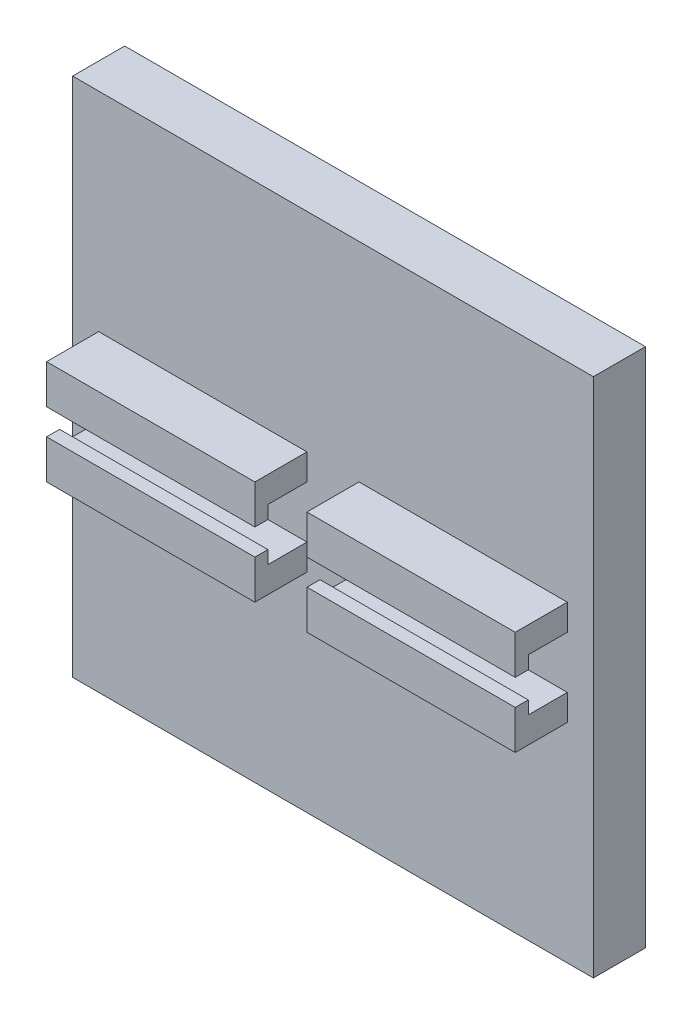
ISO-10303-21;
HEADER;
FILE_DESCRIPTION(('STEP AP214'),'2;1');
FILE_NAME('part.step','',(''),(''),'','','');
FILE_SCHEMA(('AUTOMOTIVE_DESIGN { 1 0 10303 214 1 1 1 1 }'));
ENDSEC;
DATA;
#1=APPLICATION_CONTEXT('core data for automotive mechanical design processes');
#2=APPLICATION_PROTOCOL_DEFINITION('international standard','automotive_design',2000,#1);
#3=PRODUCT_CONTEXT('',#1,'mechanical');
#4=PRODUCT('Part','Part','',(#3));
#5=PRODUCT_RELATED_PRODUCT_CATEGORY('part','',(#4));
#6=PRODUCT_DEFINITION_FORMATION('','',#4);
#7=PRODUCT_DEFINITION_CONTEXT('part definition',#1,'design');
#8=PRODUCT_DEFINITION('design','',#6,#7);
#9=PRODUCT_DEFINITION_SHAPE('','',#8);
#10=(LENGTH_UNIT() NAMED_UNIT(*) SI_UNIT(.MILLI.,.METRE.));
#11=(NAMED_UNIT(*) PLANE_ANGLE_UNIT() SI_UNIT($,.RADIAN.));
#12=(NAMED_UNIT(*) SI_UNIT($,.STERADIAN.) SOLID_ANGLE_UNIT());
#13=UNCERTAINTY_MEASURE_WITH_UNIT(LENGTH_MEASURE(1.E-05),#10,'distance_accuracy_value','');
#14=(GEOMETRIC_REPRESENTATION_CONTEXT(3) GLOBAL_UNCERTAINTY_ASSIGNED_CONTEXT((#13)) GLOBAL_UNIT_ASSIGNED_CONTEXT((#10,
#11,#12)) REPRESENTATION_CONTEXT('',''));
#15=CARTESIAN_POINT('',(0.,0.,0.));
#16=DIRECTION('',(0.,0.,1.));
#17=DIRECTION('',(1.,0.,0.));
#18=AXIS2_PLACEMENT_3D('',#15,#16,#17);
#19=CARTESIAN_POINT('',(5.00000000000001,10.,20.));
#20=DIRECTION('',(-1.,0.,0.));
#21=DIRECTION('',(0.,-1.,0.));
#22=AXIS2_PLACEMENT_3D('',#19,#20,#21);
#23=PLANE('',#22);
#24=DIRECTION('',(0.,1.,0.));
#25=VECTOR('',#24,1.);
#26=CARTESIAN_POINT('',(5.00000000000001,10.,20.));
#27=LINE('',#26,#25);
#28=CARTESIAN_POINT('',(5.00000000000001,-10.,20.));
#29=VERTEX_POINT('',#28);
#30=CARTESIAN_POINT('',(5.00000000000001,-2.5,20.));
#31=VERTEX_POINT('',#30);
#32=EDGE_CURVE('E267',#29,#31,#27,.T.);
#33=ORIENTED_EDGE('',*,*,#32,.T.);
#34=DIRECTION('',(0.,0.,-1.));
#35=VECTOR('',#34,1.);
#36=CARTESIAN_POINT('',(5.00000000000001,-2.5,20.));
#37=LINE('',#36,#35);
#38=CARTESIAN_POINT('',(5.00000000000001,-2.5,17.5));
#39=VERTEX_POINT('',#38);
#40=EDGE_CURVE('E47',#31,#39,#37,.T.);
#41=ORIENTED_EDGE('',*,*,#40,.T.);
#42=DIRECTION('',(0.,-1.,0.));
#43=VECTOR('',#42,1.);
#44=CARTESIAN_POINT('',(5.00000000000001,-2.5,17.5));
#45=LINE('',#44,#43);
#46=CARTESIAN_POINT('',(5.00000000000001,-5.,17.5));
#47=VERTEX_POINT('',#46);
#48=EDGE_CURVE('E246',#39,#47,#45,.T.);
#49=ORIENTED_EDGE('',*,*,#48,.T.);
#50=DIRECTION('',(0.,0.,-1.));
#51=VECTOR('',#50,1.);
#52=CARTESIAN_POINT('',(5.00000000000001,-5.,17.5));
#53=LINE('',#52,#51);
#54=CARTESIAN_POINT('',(5.00000000000001,-5.,10.));
#55=VERTEX_POINT('',#54);
#56=EDGE_CURVE('E243',#47,#55,#53,.T.);
#57=ORIENTED_EDGE('',*,*,#56,.T.);
#58=DIRECTION('',(0.,1.,0.));
#59=VECTOR('',#58,1.);
#60=CARTESIAN_POINT('',(5.00000000000001,10.,10.));
#61=LINE('',#60,#59);
#62=CARTESIAN_POINT('',(5.00000000000001,-10.,10.));
#63=VERTEX_POINT('',#62);
#64=EDGE_CURVE('E282',#63,#55,#61,.T.);
#65=ORIENTED_EDGE('',*,*,#64,.F.);
#66=DIRECTION('',(0.,0.,-1.));
#67=VECTOR('',#66,1.);
#68=CARTESIAN_POINT('',(5.00000000000001,-10.,20.));
#69=LINE('',#68,#67);
#70=EDGE_CURVE('E298',#29,#63,#69,.T.);
#71=ORIENTED_EDGE('',*,*,#70,.F.);
#72=EDGE_LOOP('',(#33,#41,#49,#57,#65,#71));
#73=FACE_BOUND('',#72,.T.);
#74=ADVANCED_FACE('F32',(#73),#23,.T.);
#75=DIRECTION('',(0.,-1.,0.));
#76=VECTOR('',#75,1.);
#77=CARTESIAN_POINT('',(5.00000000000001,5.,17.5));
#78=LINE('',#77,#76);
#79=CARTESIAN_POINT('',(5.00000000000001,5.,17.5));
#80=VERTEX_POINT('',#79);
#81=CARTESIAN_POINT('',(5.00000000000001,2.5,17.5));
#82=VERTEX_POINT('',#81);
#83=EDGE_CURVE('E232',#80,#82,#78,.T.);
#84=ORIENTED_EDGE('',*,*,#83,.T.);
#85=DIRECTION('',(0.,0.,1.));
#86=VECTOR('',#85,1.);
#87=CARTESIAN_POINT('',(5.00000000000001,2.5,20.));
#88=LINE('',#87,#86);
#89=CARTESIAN_POINT('',(5.00000000000001,2.5,20.));
#90=VERTEX_POINT('',#89);
#91=EDGE_CURVE('E229',#82,#90,#88,.T.);
#92=ORIENTED_EDGE('',*,*,#91,.T.);
#93=CARTESIAN_POINT('',(5.00000000000001,10.,20.));
#94=VERTEX_POINT('',#93);
#95=EDGE_CURVE('E271',#90,#94,#27,.T.);
#96=ORIENTED_EDGE('',*,*,#95,.T.);
#97=DIRECTION('',(0.,0.,-1.));
#98=VECTOR('',#97,1.);
#99=CARTESIAN_POINT('',(5.00000000000001,10.,20.));
#100=LINE('',#99,#98);
#101=CARTESIAN_POINT('',(5.00000000000001,10.,10.));
#102=VERTEX_POINT('',#101);
#103=EDGE_CURVE('E281',#94,#102,#100,.T.);
#104=ORIENTED_EDGE('',*,*,#103,.T.);
#105=CARTESIAN_POINT('',(5.00000000000001,5.,10.));
#106=VERTEX_POINT('',#105);
#107=EDGE_CURVE('E242',#106,#102,#61,.T.);
#108=ORIENTED_EDGE('',*,*,#107,.F.);
#109=DIRECTION('',(0.,0.,1.));
#110=VECTOR('',#109,1.);
#111=CARTESIAN_POINT('',(5.00000000000001,5.,17.5));
#112=LINE('',#111,#110);
#113=EDGE_CURVE('E222',#106,#80,#112,.T.);
#114=ORIENTED_EDGE('',*,*,#113,.T.);
#115=EDGE_LOOP('',(#84,#92,#96,#104,#108,#114));
#116=FACE_BOUND('',#115,.T.);
#117=ADVANCED_FACE('F240',(#116),#23,.T.);
#118=CARTESIAN_POINT('',(45.,10.,20.));
#119=DIRECTION('',(1.,0.,0.));
#120=DIRECTION('',(0.,1.,0.));
#121=AXIS2_PLACEMENT_3D('',#118,#119,#120);
#122=PLANE('',#121);
#123=DIRECTION('',(0.,1.,0.));
#124=VECTOR('',#123,1.);
#125=CARTESIAN_POINT('',(45.,10.,17.5));
#126=LINE('',#125,#124);
#127=CARTESIAN_POINT('',(45.,-5.00000000000001,17.5));
#128=VERTEX_POINT('',#127);
#129=CARTESIAN_POINT('',(45.,-2.50000000000002,17.5));
#130=VERTEX_POINT('',#129);
#131=EDGE_CURVE('E11',#128,#130,#126,.T.);
#132=ORIENTED_EDGE('',*,*,#131,.T.);
#133=DIRECTION('',(0.,0.,1.));
#134=VECTOR('',#133,1.);
#135=CARTESIAN_POINT('',(45.,-2.50000000000002,20.));
#136=LINE('',#135,#134);
#137=CARTESIAN_POINT('',(45.,-2.50000000000002,20.));
#138=VERTEX_POINT('',#137);
#139=EDGE_CURVE('E254',#130,#138,#136,.T.);
#140=ORIENTED_EDGE('',*,*,#139,.T.);
#141=DIRECTION('',(0.,-1.,0.));
#142=VECTOR('',#141,1.);
#143=CARTESIAN_POINT('',(45.,10.,20.));
#144=LINE('',#143,#142);
#145=CARTESIAN_POINT('',(45.,-10.,20.));
#146=VERTEX_POINT('',#145);
#147=EDGE_CURVE('E274',#138,#146,#144,.T.);
#148=ORIENTED_EDGE('',*,*,#147,.T.);
#149=DIRECTION('',(0.,0.,-1.));
#150=VECTOR('',#149,1.);
#151=CARTESIAN_POINT('',(45.,-10.,20.));
#152=LINE('',#151,#150);
#153=CARTESIAN_POINT('',(45.,-10.,10.));
#154=VERTEX_POINT('',#153);
#155=EDGE_CURVE('E295',#146,#154,#152,.T.);
#156=ORIENTED_EDGE('',*,*,#155,.T.);
#157=DIRECTION('',(0.,-1.,0.));
#158=VECTOR('',#157,1.);
#159=CARTESIAN_POINT('',(45.,10.,10.));
#160=LINE('',#159,#158);
#161=CARTESIAN_POINT('',(45.,-5.00000000000001,10.));
#162=VERTEX_POINT('',#161);
#163=EDGE_CURVE('E285',#162,#154,#160,.T.);
#164=ORIENTED_EDGE('',*,*,#163,.F.);
#165=DIRECTION('',(0.,0.,1.));
#166=VECTOR('',#165,1.);
#167=CARTESIAN_POINT('',(45.,-5.00000000000001,20.));
#168=LINE('',#167,#166);
#169=EDGE_CURVE('E40',#162,#128,#168,.T.);
#170=ORIENTED_EDGE('',*,*,#169,.T.);
#171=EDGE_LOOP('',(#132,#140,#148,#156,#164,#170));
#172=FACE_BOUND('',#171,.T.);
#173=ADVANCED_FACE('F426',(#172),#122,.T.);
#174=CARTESIAN_POINT('',(45.,10.,20.));
#175=VERTEX_POINT('',#174);
#176=CARTESIAN_POINT('',(45.,2.49999999999998,20.));
#177=VERTEX_POINT('',#176);
#178=EDGE_CURVE('E275',#175,#177,#144,.T.);
#179=ORIENTED_EDGE('',*,*,#178,.T.);
#180=DIRECTION('',(0.,0.,-1.));
#181=VECTOR('',#180,1.);
#182=CARTESIAN_POINT('',(45.,2.49999999999998,20.));
#183=LINE('',#182,#181);
#184=CARTESIAN_POINT('',(45.,2.49999999999999,17.5));
#185=VERTEX_POINT('',#184);
#186=EDGE_CURVE('E264',#177,#185,#183,.T.);
#187=ORIENTED_EDGE('',*,*,#186,.T.);
#188=DIRECTION('',(0.,1.,0.));
#189=VECTOR('',#188,1.);
#190=CARTESIAN_POINT('',(45.,10.,17.5));
#191=LINE('',#190,#189);
#192=CARTESIAN_POINT('',(45.,4.99999999999999,17.5));
#193=VERTEX_POINT('',#192);
#194=EDGE_CURVE('E422',#185,#193,#191,.T.);
#195=ORIENTED_EDGE('',*,*,#194,.T.);
#196=DIRECTION('',(0.,0.,-1.));
#197=VECTOR('',#196,1.);
#198=CARTESIAN_POINT('',(45.,4.99999999999999,20.));
#199=LINE('',#198,#197);
#200=CARTESIAN_POINT('',(45.,4.99999999999999,10.));
#201=VERTEX_POINT('',#200);
#202=EDGE_CURVE('E225',#193,#201,#199,.T.);
#203=ORIENTED_EDGE('',*,*,#202,.T.);
#204=CARTESIAN_POINT('',(45.,10.,10.));
#205=VERTEX_POINT('',#204);
#206=EDGE_CURVE('E286',#205,#201,#160,.T.);
#207=ORIENTED_EDGE('',*,*,#206,.F.);
#208=DIRECTION('',(0.,0.,-1.));
#209=VECTOR('',#208,1.);
#210=CARTESIAN_POINT('',(45.,10.,20.));
#211=LINE('',#210,#209);
#212=EDGE_CURVE('E292',#175,#205,#211,.T.);
#213=ORIENTED_EDGE('',*,*,#212,.F.);
#214=EDGE_LOOP('',(#179,#187,#195,#203,#207,#213));
#215=FACE_BOUND('',#214,.T.);
#216=ADVANCED_FACE('F588',(#215),#122,.T.);
#217=CARTESIAN_POINT('',(0.,0.,20.));
#218=DIRECTION('',(0.,0.,1.));
#219=DIRECTION('',(-1.,0.,0.));
#220=AXIS2_PLACEMENT_3D('',#217,#218,#219);
#221=PLANE('',#220);
#222=ORIENTED_EDGE('',*,*,#95,.F.);
#223=DIRECTION('',(1.,0.,0.));
#224=VECTOR('',#223,1.);
#225=CARTESIAN_POINT('',(0.,2.5,20.));
#226=LINE('',#225,#224);
#227=EDGE_CURVE('E418',#90,#177,#226,.T.);
#228=ORIENTED_EDGE('',*,*,#227,.T.);
#229=ORIENTED_EDGE('',*,*,#178,.F.);
#230=DIRECTION('',(1.,0.,0.));
#231=VECTOR('',#230,1.);
#232=CARTESIAN_POINT('',(45.,10.,20.));
#233=LINE('',#232,#231);
#234=EDGE_CURVE('E278',#94,#175,#233,.T.);
#235=ORIENTED_EDGE('',*,*,#234,.F.);
#236=EDGE_LOOP('',(#222,#228,#229,#235));
#237=FACE_BOUND('',#236,.T.);
#238=ADVANCED_FACE('F583',(#237),#221,.T.);
#239=ORIENTED_EDGE('',*,*,#147,.F.);
#240=DIRECTION('',(-1.,0.,0.));
#241=VECTOR('',#240,1.);
#242=CARTESIAN_POINT('',(0.,-2.5,20.));
#243=LINE('',#242,#241);
#244=EDGE_CURVE('E416',#138,#31,#243,.T.);
#245=ORIENTED_EDGE('',*,*,#244,.T.);
#246=ORIENTED_EDGE('',*,*,#32,.F.);
#247=DIRECTION('',(-1.,0.,0.));
#248=VECTOR('',#247,1.);
#249=CARTESIAN_POINT('',(45.,-10.,20.));
#250=LINE('',#249,#248);
#251=EDGE_CURVE('E270',#146,#29,#250,.T.);
#252=ORIENTED_EDGE('',*,*,#251,.F.);
#253=EDGE_LOOP('',(#239,#245,#246,#252));
#254=FACE_BOUND('',#253,.T.);
#255=ADVANCED_FACE('F446',(#254),#221,.T.);
#256=CARTESIAN_POINT('',(-5.00000000000001,10.,20.));
#257=DIRECTION('',(-1.,0.,0.));
#258=DIRECTION('',(0.,-1.,0.));
#259=AXIS2_PLACEMENT_3D('',#256,#257,#258);
#260=PLANE('',#259);
#261=DIRECTION('',(0.,1.,0.));
#262=VECTOR('',#261,1.);
#263=CARTESIAN_POINT('',(-5.00000000000001,10.,10.));
#264=LINE('',#263,#262);
#265=CARTESIAN_POINT('',(-5.00000000000001,-10.,10.));
#266=VERTEX_POINT('',#265);
#267=CARTESIAN_POINT('',(-5.00000000000001,-5.,10.));
#268=VERTEX_POINT('',#267);
#269=EDGE_CURVE('E349',#266,#268,#264,.T.);
#270=ORIENTED_EDGE('',*,*,#269,.T.);
#271=DIRECTION('',(0.,0.,-1.));
#272=VECTOR('',#271,1.);
#273=CARTESIAN_POINT('',(-5.00000000000001,-5.,17.5));
#274=LINE('',#273,#272);
#275=CARTESIAN_POINT('',(-5.00000000000001,-5.,17.5));
#276=VERTEX_POINT('',#275);
#277=EDGE_CURVE('E311',#276,#268,#274,.T.);
#278=ORIENTED_EDGE('',*,*,#277,.F.);
#279=DIRECTION('',(0.,-1.,0.));
#280=VECTOR('',#279,1.);
#281=CARTESIAN_POINT('',(-5.00000000000001,-2.5,17.5));
#282=LINE('',#281,#280);
#283=CARTESIAN_POINT('',(-5.00000000000001,-2.5,17.5));
#284=VERTEX_POINT('',#283);
#285=EDGE_CURVE('E308',#284,#276,#282,.T.);
#286=ORIENTED_EDGE('',*,*,#285,.F.);
#287=DIRECTION('',(0.,0.,-1.));
#288=VECTOR('',#287,1.);
#289=CARTESIAN_POINT('',(-5.00000000000001,-2.5,20.));
#290=LINE('',#289,#288);
#291=CARTESIAN_POINT('',(-5.00000000000001,-2.5,20.));
#292=VERTEX_POINT('',#291);
#293=EDGE_CURVE('E305',#292,#284,#290,.T.);
#294=ORIENTED_EDGE('',*,*,#293,.F.);
#295=DIRECTION('',(0.,1.,0.));
#296=VECTOR('',#295,1.);
#297=CARTESIAN_POINT('',(-5.00000000000001,10.,20.));
#298=LINE('',#297,#296);
#299=CARTESIAN_POINT('',(-5.00000000000001,-10.,20.));
#300=VERTEX_POINT('',#299);
#301=EDGE_CURVE('E336',#300,#292,#298,.T.);
#302=ORIENTED_EDGE('',*,*,#301,.F.);
#303=DIRECTION('',(0.,0.,-1.));
#304=VECTOR('',#303,1.);
#305=CARTESIAN_POINT('',(-5.00000000000001,-10.,20.));
#306=LINE('',#305,#304);
#307=EDGE_CURVE('E348',#300,#266,#306,.T.);
#308=ORIENTED_EDGE('',*,*,#307,.T.);
#309=EDGE_LOOP('',(#270,#278,#286,#294,#302,#308));
#310=FACE_BOUND('',#309,.T.);
#311=ADVANCED_FACE('F511',(#310),#260,.F.);
#312=CARTESIAN_POINT('',(-45.,10.,20.));
#313=DIRECTION('',(1.,0.,0.));
#314=DIRECTION('',(0.,1.,0.));
#315=AXIS2_PLACEMENT_3D('',#312,#313,#314);
#316=PLANE('',#315);
#317=DIRECTION('',(0.,-1.,0.));
#318=VECTOR('',#317,1.);
#319=CARTESIAN_POINT('',(-45.,10.,17.5));
#320=LINE('',#319,#318);
#321=CARTESIAN_POINT('',(-45.,-2.50000000000002,17.5));
#322=VERTEX_POINT('',#321);
#323=CARTESIAN_POINT('',(-45.,-5.00000000000001,17.5));
#324=VERTEX_POINT('',#323);
#325=EDGE_CURVE('E410',#322,#324,#320,.T.);
#326=ORIENTED_EDGE('',*,*,#325,.T.);
#327=DIRECTION('',(0.,0.,-1.));
#328=VECTOR('',#327,1.);
#329=CARTESIAN_POINT('',(-45.,-5.00000000000001,20.));
#330=LINE('',#329,#328);
#331=CARTESIAN_POINT('',(-45.,-5.00000000000001,10.));
#332=VERTEX_POINT('',#331);
#333=EDGE_CURVE('E413',#324,#332,#330,.T.);
#334=ORIENTED_EDGE('',*,*,#333,.T.);
#335=DIRECTION('',(0.,-1.,0.));
#336=VECTOR('',#335,1.);
#337=CARTESIAN_POINT('',(-45.,10.,10.));
#338=LINE('',#337,#336);
#339=CARTESIAN_POINT('',(-45.,-10.,10.));
#340=VERTEX_POINT('',#339);
#341=EDGE_CURVE('E354',#332,#340,#338,.T.);
#342=ORIENTED_EDGE('',*,*,#341,.T.);
#343=DIRECTION('',(0.,0.,-1.));
#344=VECTOR('',#343,1.);
#345=CARTESIAN_POINT('',(-45.,-10.,20.));
#346=LINE('',#345,#344);
#347=CARTESIAN_POINT('',(-45.,-10.,20.));
#348=VERTEX_POINT('',#347);
#349=EDGE_CURVE('E362',#348,#340,#346,.T.);
#350=ORIENTED_EDGE('',*,*,#349,.F.);
#351=DIRECTION('',(0.,-1.,0.));
#352=VECTOR('',#351,1.);
#353=CARTESIAN_POINT('',(-45.,10.,20.));
#354=LINE('',#353,#352);
#355=CARTESIAN_POINT('',(-45.,-2.50000000000002,20.));
#356=VERTEX_POINT('',#355);
#357=EDGE_CURVE('E342',#356,#348,#354,.T.);
#358=ORIENTED_EDGE('',*,*,#357,.F.);
#359=DIRECTION('',(0.,0.,-1.));
#360=VECTOR('',#359,1.);
#361=CARTESIAN_POINT('',(-45.,-2.50000000000002,20.));
#362=LINE('',#361,#360);
#363=EDGE_CURVE('E332',#356,#322,#362,.T.);
#364=ORIENTED_EDGE('',*,*,#363,.T.);
#365=EDGE_LOOP('',(#326,#334,#342,#350,#358,#364));
#366=FACE_BOUND('',#365,.T.);
#367=ADVANCED_FACE('F502',(#366),#316,.F.);
#368=CARTESIAN_POINT('',(0.,0.,20.));
#369=DIRECTION('',(0.,0.,1.));
#370=DIRECTION('',(1.,0.,0.));
#371=AXIS2_PLACEMENT_3D('',#368,#369,#370);
#372=PLANE('',#371);
#373=DIRECTION('',(1.,0.,0.));
#374=VECTOR('',#373,1.);
#375=CARTESIAN_POINT('',(0.,-2.5,20.));
#376=LINE('',#375,#374);
#377=EDGE_CURVE('E402',#356,#292,#376,.T.);
#378=ORIENTED_EDGE('',*,*,#377,.F.);
#379=ORIENTED_EDGE('',*,*,#357,.T.);
#380=DIRECTION('',(1.,0.,0.));
#381=VECTOR('',#380,1.);
#382=CARTESIAN_POINT('',(-45.,-10.,20.));
#383=LINE('',#382,#381);
#384=EDGE_CURVE('E346',#348,#300,#383,.T.);
#385=ORIENTED_EDGE('',*,*,#384,.T.);
#386=ORIENTED_EDGE('',*,*,#301,.T.);
#387=EDGE_LOOP('',(#378,#379,#385,#386));
#388=FACE_BOUND('',#387,.T.);
#389=ADVANCED_FACE('F493',(#388),#372,.T.);
#390=CARTESIAN_POINT('',(0.,0.,10.));
#391=DIRECTION('',(0.,0.,1.));
#392=DIRECTION('',(1.,0.,0.));
#393=AXIS2_PLACEMENT_3D('',#390,#391,#392);
#394=PLANE('',#393);
#395=DIRECTION('',(-1.,0.,0.));
#396=VECTOR('',#395,1.);
#397=CARTESIAN_POINT('',(50.,-5.00000000000002,10.));
#398=LINE('',#397,#396);
#399=EDGE_CURVE('E259',#162,#55,#398,.T.);
#400=ORIENTED_EDGE('',*,*,#399,.F.);
#401=ORIENTED_EDGE('',*,*,#163,.T.);
#402=DIRECTION('',(-1.,0.,0.));
#403=VECTOR('',#402,1.);
#404=CARTESIAN_POINT('',(45.,-10.,10.));
#405=LINE('',#404,#403);
#406=EDGE_CURVE('E55',#154,#63,#405,.T.);
#407=ORIENTED_EDGE('',*,*,#406,.T.);
#408=ORIENTED_EDGE('',*,*,#64,.T.);
#409=EDGE_LOOP('',(#400,#401,#407,#408));
#410=FACE_BOUND('',#409,.T.);
#411=DIRECTION('',(0.,1.,0.));
#412=VECTOR('',#411,1.);
#413=CARTESIAN_POINT('',(50.,50.,10.));
#414=LINE('',#413,#412);
#415=CARTESIAN_POINT('',(50.,-50.,10.));
#416=VERTEX_POINT('',#415);
#417=CARTESIAN_POINT('',(50.,50.,10.));
#418=VERTEX_POINT('',#417);
#419=EDGE_CURVE('E372',#416,#418,#414,.T.);
#420=ORIENTED_EDGE('',*,*,#419,.T.);
#421=DIRECTION('',(-1.,0.,0.));
#422=VECTOR('',#421,1.);
#423=CARTESIAN_POINT('',(-50.,50.,10.));
#424=LINE('',#423,#422);
#425=CARTESIAN_POINT('',(-50.,50.,10.));
#426=VERTEX_POINT('',#425);
#427=EDGE_CURVE('E374',#418,#426,#424,.T.);
#428=ORIENTED_EDGE('',*,*,#427,.T.);
#429=DIRECTION('',(0.,-1.,0.));
#430=VECTOR('',#429,1.);
#431=CARTESIAN_POINT('',(-50.,50.,10.));
#432=LINE('',#431,#430);
#433=CARTESIAN_POINT('',(-50.,-50.,10.));
#434=VERTEX_POINT('',#433);
#435=EDGE_CURVE('E377',#426,#434,#432,.T.);
#436=ORIENTED_EDGE('',*,*,#435,.T.);
#437=DIRECTION('',(1.,0.,0.));
#438=VECTOR('',#437,1.);
#439=CARTESIAN_POINT('',(-50.,-50.,10.));
#440=LINE('',#439,#438);
#441=EDGE_CURVE('E379',#434,#416,#440,.T.);
#442=ORIENTED_EDGE('',*,*,#441,.T.);
#443=EDGE_LOOP('',(#420,#428,#436,#442));
#444=FACE_BOUND('',#443,.T.);
#445=ORIENTED_EDGE('',*,*,#206,.T.);
#446=DIRECTION('',(-1.,0.,0.));
#447=VECTOR('',#446,1.);
#448=CARTESIAN_POINT('',(50.,4.99999999999998,10.));
#449=LINE('',#448,#447);
#450=EDGE_CURVE('E228',#201,#106,#449,.T.);
#451=ORIENTED_EDGE('',*,*,#450,.T.);
#452=ORIENTED_EDGE('',*,*,#107,.T.);
#453=DIRECTION('',(1.,0.,0.));
#454=VECTOR('',#453,1.);
#455=CARTESIAN_POINT('',(45.,10.,10.));
#456=LINE('',#455,#454);
#457=EDGE_CURVE('E289',#102,#205,#456,.T.);
#458=ORIENTED_EDGE('',*,*,#457,.T.);
#459=EDGE_LOOP('',(#445,#451,#452,#458));
#460=FACE_BOUND('',#459,.T.);
#461=ORIENTED_EDGE('',*,*,#341,.F.);
#462=DIRECTION('',(1.,0.,0.));
#463=VECTOR('',#462,1.);
#464=CARTESIAN_POINT('',(-50.,-5.00000000000002,10.));
#465=LINE('',#464,#463);
#466=EDGE_CURVE('E323',#332,#268,#465,.T.);
#467=ORIENTED_EDGE('',*,*,#466,.T.);
#468=ORIENTED_EDGE('',*,*,#269,.F.);
#469=DIRECTION('',(1.,0.,0.));
#470=VECTOR('',#469,1.);
#471=CARTESIAN_POINT('',(-45.,-10.,10.));
#472=LINE('',#471,#470);
#473=EDGE_CURVE('E358',#340,#266,#472,.T.);
#474=ORIENTED_EDGE('',*,*,#473,.F.);
#475=EDGE_LOOP('',(#461,#467,#468,#474));
#476=FACE_BOUND('',#475,.T.);
#477=DIRECTION('',(1.,0.,0.));
#478=VECTOR('',#477,1.);
#479=CARTESIAN_POINT('',(-50.,4.99999999999998,10.));
#480=LINE('',#479,#478);
#481=CARTESIAN_POINT('',(-45.,4.99999999999999,10.));
#482=VERTEX_POINT('',#481);
#483=CARTESIAN_POINT('',(-5.00000000000001,5.,10.));
#484=VERTEX_POINT('',#483);
#485=EDGE_CURVE('E321',#482,#484,#480,.T.);
#486=ORIENTED_EDGE('',*,*,#485,.F.);
#487=CARTESIAN_POINT('',(-45.,10.,10.));
#488=VERTEX_POINT('',#487);
#489=EDGE_CURVE('E355',#488,#482,#338,.T.);
#490=ORIENTED_EDGE('',*,*,#489,.F.);
#491=DIRECTION('',(-1.,0.,0.));
#492=VECTOR('',#491,1.);
#493=CARTESIAN_POINT('',(-45.,10.,10.));
#494=LINE('',#493,#492);
#495=CARTESIAN_POINT('',(-5.00000000000001,10.,10.));
#496=VERTEX_POINT('',#495);
#497=EDGE_CURVE('E352',#496,#488,#494,.T.);
#498=ORIENTED_EDGE('',*,*,#497,.F.);
#499=EDGE_CURVE('E335',#484,#496,#264,.T.);
#500=ORIENTED_EDGE('',*,*,#499,.F.);
#501=EDGE_LOOP('',(#486,#490,#498,#500));
#502=FACE_BOUND('',#501,.T.);
#503=ADVANCED_FACE('F432',(#410,#444,#460,#476,#502),#394,.T.);
#504=CARTESIAN_POINT('',(50.,50.,10.));
#505=DIRECTION('',(-1.,0.,0.));
#506=DIRECTION('',(0.,-1.,0.));
#507=AXIS2_PLACEMENT_3D('',#504,#505,#506);
#508=PLANE('',#507);
#509=DIRECTION('',(0.,1.,0.));
#510=VECTOR('',#509,1.);
#511=CARTESIAN_POINT('',(50.,50.,0.));
#512=LINE('',#511,#510);
#513=CARTESIAN_POINT('',(50.,-50.,0.));
#514=VERTEX_POINT('',#513);
#515=CARTESIAN_POINT('',(50.,50.,0.));
#516=VERTEX_POINT('',#515);
#517=EDGE_CURVE('E371',#514,#516,#512,.T.);
#518=ORIENTED_EDGE('',*,*,#517,.T.);
#519=DIRECTION('',(0.,0.,-1.));
#520=VECTOR('',#519,1.);
#521=CARTESIAN_POINT('',(50.,50.,10.));
#522=LINE('',#521,#520);
#523=EDGE_CURVE('E397',#418,#516,#522,.T.);
#524=ORIENTED_EDGE('',*,*,#523,.F.);
#525=ORIENTED_EDGE('',*,*,#419,.F.);
#526=DIRECTION('',(0.,0.,-1.));
#527=VECTOR('',#526,1.);
#528=CARTESIAN_POINT('',(50.,-50.,10.));
#529=LINE('',#528,#527);
#530=EDGE_CURVE('E381',#416,#514,#529,.T.);
#531=ORIENTED_EDGE('',*,*,#530,.T.);
#532=EDGE_LOOP('',(#518,#524,#525,#531));
#533=FACE_BOUND('',#532,.T.);
#534=ADVANCED_FACE('F34',(#533),#508,.F.);
#535=CARTESIAN_POINT('',(-50.,50.,10.));
#536=DIRECTION('',(0.,-1.,0.));
#537=DIRECTION('',(0.,0.,-1.));
#538=AXIS2_PLACEMENT_3D('',#535,#536,#537);
#539=PLANE('',#538);
#540=DIRECTION('',(-1.,0.,0.));
#541=VECTOR('',#540,1.);
#542=CARTESIAN_POINT('',(-50.,50.,0.));
#543=LINE('',#542,#541);
#544=CARTESIAN_POINT('',(-50.,50.,0.));
#545=VERTEX_POINT('',#544);
#546=EDGE_CURVE('E384',#516,#545,#543,.T.);
#547=ORIENTED_EDGE('',*,*,#546,.T.);
#548=DIRECTION('',(0.,0.,-1.));
#549=VECTOR('',#548,1.);
#550=CARTESIAN_POINT('',(-50.,50.,10.));
#551=LINE('',#550,#549);
#552=EDGE_CURVE('E394',#426,#545,#551,.T.);
#553=ORIENTED_EDGE('',*,*,#552,.F.);
#554=ORIENTED_EDGE('',*,*,#427,.F.);
#555=ORIENTED_EDGE('',*,*,#523,.T.);
#556=EDGE_LOOP('',(#547,#553,#554,#555));
#557=FACE_BOUND('',#556,.T.);
#558=ADVANCED_FACE('F523',(#557),#539,.F.);
#559=CARTESIAN_POINT('',(-50.,50.,10.));
#560=DIRECTION('',(1.,0.,0.));
#561=DIRECTION('',(0.,1.,0.));
#562=AXIS2_PLACEMENT_3D('',#559,#560,#561);
#563=PLANE('',#562);
#564=DIRECTION('',(0.,-1.,0.));
#565=VECTOR('',#564,1.);
#566=CARTESIAN_POINT('',(-50.,50.,0.));
#567=LINE('',#566,#565);
#568=CARTESIAN_POINT('',(-50.,-50.,0.));
#569=VERTEX_POINT('',#568);
#570=EDGE_CURVE('E386',#545,#569,#567,.T.);
#571=ORIENTED_EDGE('',*,*,#570,.T.);
#572=DIRECTION('',(0.,0.,-1.));
#573=VECTOR('',#572,1.);
#574=CARTESIAN_POINT('',(-50.,-50.,10.));
#575=LINE('',#574,#573);
#576=EDGE_CURVE('E391',#434,#569,#575,.T.);
#577=ORIENTED_EDGE('',*,*,#576,.F.);
#578=ORIENTED_EDGE('',*,*,#435,.F.);
#579=ORIENTED_EDGE('',*,*,#552,.T.);
#580=EDGE_LOOP('',(#571,#577,#578,#579));
#581=FACE_BOUND('',#580,.T.);
#582=ADVANCED_FACE('F520',(#581),#563,.F.);
#583=CARTESIAN_POINT('',(-50.,-50.,10.));
#584=DIRECTION('',(0.,1.,0.));
#585=DIRECTION('',(0.,0.,1.));
#586=AXIS2_PLACEMENT_3D('',#583,#584,#585);
#587=PLANE('',#586);
#588=DIRECTION('',(1.,0.,0.));
#589=VECTOR('',#588,1.);
#590=CARTESIAN_POINT('',(-50.,-50.,0.));
#591=LINE('',#590,#589);
#592=EDGE_CURVE('E375',#569,#514,#591,.T.);
#593=ORIENTED_EDGE('',*,*,#592,.T.);
#594=ORIENTED_EDGE('',*,*,#530,.F.);
#595=ORIENTED_EDGE('',*,*,#441,.F.);
#596=ORIENTED_EDGE('',*,*,#576,.T.);
#597=EDGE_LOOP('',(#593,#594,#595,#596));
#598=FACE_BOUND('',#597,.T.);
#599=ADVANCED_FACE('F516',(#598),#587,.F.);
#600=CARTESIAN_POINT('',(0.,0.,0.));
#601=DIRECTION('',(0.,0.,1.));
#602=DIRECTION('',(1.,0.,0.));
#603=AXIS2_PLACEMENT_3D('',#600,#601,#602);
#604=PLANE('',#603);
#605=ORIENTED_EDGE('',*,*,#517,.F.);
#606=ORIENTED_EDGE('',*,*,#592,.F.);
#607=ORIENTED_EDGE('',*,*,#570,.F.);
#608=ORIENTED_EDGE('',*,*,#546,.F.);
#609=EDGE_LOOP('',(#605,#606,#607,#608));
#610=FACE_BOUND('',#609,.T.);
#611=ADVANCED_FACE('F509',(#610),#604,.F.);
#612=DIRECTION('',(0.,-1.,0.));
#613=VECTOR('',#612,1.);
#614=CARTESIAN_POINT('',(-5.00000000000001,5.,17.5));
#615=LINE('',#614,#613);
#616=CARTESIAN_POINT('',(-5.00000000000001,5.,17.5));
#617=VERTEX_POINT('',#616);
#618=CARTESIAN_POINT('',(-5.00000000000001,2.5,17.5));
#619=VERTEX_POINT('',#618);
#620=EDGE_CURVE('E300',#617,#619,#615,.T.);
#621=ORIENTED_EDGE('',*,*,#620,.F.);
#622=DIRECTION('',(0.,0.,1.));
#623=VECTOR('',#622,1.);
#624=CARTESIAN_POINT('',(-5.00000000000001,5.,17.5));
#625=LINE('',#624,#623);
#626=EDGE_CURVE('E314',#484,#617,#625,.T.);
#627=ORIENTED_EDGE('',*,*,#626,.F.);
#628=ORIENTED_EDGE('',*,*,#499,.T.);
#629=DIRECTION('',(0.,0.,-1.));
#630=VECTOR('',#629,1.);
#631=CARTESIAN_POINT('',(-5.00000000000001,10.,20.));
#632=LINE('',#631,#630);
#633=CARTESIAN_POINT('',(-5.00000000000001,10.,20.));
#634=VERTEX_POINT('',#633);
#635=EDGE_CURVE('E368',#634,#496,#632,.T.);
#636=ORIENTED_EDGE('',*,*,#635,.F.);
#637=CARTESIAN_POINT('',(-5.00000000000001,2.5,20.));
#638=VERTEX_POINT('',#637);
#639=EDGE_CURVE('E340',#638,#634,#298,.T.);
#640=ORIENTED_EDGE('',*,*,#639,.F.);
#641=DIRECTION('',(0.,0.,1.));
#642=VECTOR('',#641,1.);
#643=CARTESIAN_POINT('',(-5.00000000000001,2.5,20.));
#644=LINE('',#643,#642);
#645=EDGE_CURVE('E303',#619,#638,#644,.T.);
#646=ORIENTED_EDGE('',*,*,#645,.F.);
#647=EDGE_LOOP('',(#621,#627,#628,#636,#640,#646));
#648=FACE_BOUND('',#647,.T.);
#649=ADVANCED_FACE('F505',(#648),#260,.F.);
#650=CARTESIAN_POINT('',(-45.,10.,20.));
#651=DIRECTION('',(0.,-1.,0.));
#652=DIRECTION('',(0.,0.,-1.));
#653=AXIS2_PLACEMENT_3D('',#650,#651,#652);
#654=PLANE('',#653);
#655=ORIENTED_EDGE('',*,*,#497,.T.);
#656=DIRECTION('',(0.,0.,-1.));
#657=VECTOR('',#656,1.);
#658=CARTESIAN_POINT('',(-45.,10.,20.));
#659=LINE('',#658,#657);
#660=CARTESIAN_POINT('',(-45.,10.,20.));
#661=VERTEX_POINT('',#660);
#662=EDGE_CURVE('E365',#661,#488,#659,.T.);
#663=ORIENTED_EDGE('',*,*,#662,.F.);
#664=DIRECTION('',(-1.,0.,0.));
#665=VECTOR('',#664,1.);
#666=CARTESIAN_POINT('',(-45.,10.,20.));
#667=LINE('',#666,#665);
#668=EDGE_CURVE('E339',#634,#661,#667,.T.);
#669=ORIENTED_EDGE('',*,*,#668,.F.);
#670=ORIENTED_EDGE('',*,*,#635,.T.);
#671=EDGE_LOOP('',(#655,#663,#669,#670));
#672=FACE_BOUND('',#671,.T.);
#673=ADVANCED_FACE('F500',(#672),#654,.F.);
#674=ORIENTED_EDGE('',*,*,#489,.T.);
#675=DIRECTION('',(0.,0.,1.));
#676=VECTOR('',#675,1.);
#677=CARTESIAN_POINT('',(-45.,4.99999999999999,20.));
#678=LINE('',#677,#676);
#679=CARTESIAN_POINT('',(-45.,4.99999999999999,17.5));
#680=VERTEX_POINT('',#679);
#681=EDGE_CURVE('E407',#482,#680,#678,.T.);
#682=ORIENTED_EDGE('',*,*,#681,.T.);
#683=DIRECTION('',(0.,-1.,0.));
#684=VECTOR('',#683,1.);
#685=CARTESIAN_POINT('',(-45.,10.,17.5));
#686=LINE('',#685,#684);
#687=CARTESIAN_POINT('',(-45.,2.49999999999999,17.5));
#688=VERTEX_POINT('',#687);
#689=EDGE_CURVE('E404',#680,#688,#686,.T.);
#690=ORIENTED_EDGE('',*,*,#689,.T.);
#691=DIRECTION('',(0.,0.,1.));
#692=VECTOR('',#691,1.);
#693=CARTESIAN_POINT('',(-45.,2.49999999999998,20.));
#694=LINE('',#693,#692);
#695=CARTESIAN_POINT('',(-45.,2.49999999999998,20.));
#696=VERTEX_POINT('',#695);
#697=EDGE_CURVE('E320',#688,#696,#694,.T.);
#698=ORIENTED_EDGE('',*,*,#697,.T.);
#699=EDGE_CURVE('E343',#661,#696,#354,.T.);
#700=ORIENTED_EDGE('',*,*,#699,.F.);
#701=ORIENTED_EDGE('',*,*,#662,.T.);
#702=EDGE_LOOP('',(#674,#682,#690,#698,#700,#701));
#703=FACE_BOUND('',#702,.T.);
#704=ADVANCED_FACE('F496',(#703),#316,.F.);
#705=CARTESIAN_POINT('',(-45.,-10.,20.));
#706=DIRECTION('',(0.,1.,0.));
#707=DIRECTION('',(0.,0.,1.));
#708=AXIS2_PLACEMENT_3D('',#705,#706,#707);
#709=PLANE('',#708);
#710=ORIENTED_EDGE('',*,*,#473,.T.);
#711=ORIENTED_EDGE('',*,*,#307,.F.);
#712=ORIENTED_EDGE('',*,*,#384,.F.);
#713=ORIENTED_EDGE('',*,*,#349,.T.);
#714=EDGE_LOOP('',(#710,#711,#712,#713));
#715=FACE_BOUND('',#714,.T.);
#716=ADVANCED_FACE('F491',(#715),#709,.F.);
#717=DIRECTION('',(-1.,0.,0.));
#718=VECTOR('',#717,1.);
#719=CARTESIAN_POINT('',(0.,2.5,20.));
#720=LINE('',#719,#718);
#721=EDGE_CURVE('E400',#638,#696,#720,.T.);
#722=ORIENTED_EDGE('',*,*,#721,.F.);
#723=ORIENTED_EDGE('',*,*,#639,.T.);
#724=ORIENTED_EDGE('',*,*,#668,.T.);
#725=ORIENTED_EDGE('',*,*,#699,.T.);
#726=EDGE_LOOP('',(#722,#723,#724,#725));
#727=FACE_BOUND('',#726,.T.);
#728=ADVANCED_FACE('F487',(#727),#372,.T.);
#729=CARTESIAN_POINT('',(-50.,4.99999999999998,17.5));
#730=DIRECTION('',(0.,0.,1.));
#731=DIRECTION('',(1.,0.,0.));
#732=AXIS2_PLACEMENT_3D('',#729,#730,#731);
#733=PLANE('',#732);
#734=DIRECTION('',(1.,0.,0.));
#735=VECTOR('',#734,1.);
#736=CARTESIAN_POINT('',(-50.,4.99999999999998,17.5));
#737=LINE('',#736,#735);
#738=EDGE_CURVE('E318',#680,#617,#737,.T.);
#739=ORIENTED_EDGE('',*,*,#738,.T.);
#740=ORIENTED_EDGE('',*,*,#620,.T.);
#741=DIRECTION('',(1.,0.,0.));
#742=VECTOR('',#741,1.);
#743=CARTESIAN_POINT('',(-50.,2.49999999999998,17.5));
#744=LINE('',#743,#742);
#745=EDGE_CURVE('E317',#688,#619,#744,.T.);
#746=ORIENTED_EDGE('',*,*,#745,.F.);
#747=ORIENTED_EDGE('',*,*,#689,.F.);
#748=EDGE_LOOP('',(#739,#740,#746,#747));
#749=FACE_BOUND('',#748,.T.);
#750=ADVANCED_FACE('F473',(#749),#733,.F.);
#751=CARTESIAN_POINT('',(-50.,4.99999999999998,17.5));
#752=DIRECTION('',(0.,1.,0.));
#753=DIRECTION('',(-1.,0.,0.));
#754=AXIS2_PLACEMENT_3D('',#751,#752,#753);
#755=PLANE('',#754);
#756=ORIENTED_EDGE('',*,*,#485,.T.);
#757=ORIENTED_EDGE('',*,*,#626,.T.);
#758=ORIENTED_EDGE('',*,*,#738,.F.);
#759=ORIENTED_EDGE('',*,*,#681,.F.);
#760=EDGE_LOOP('',(#756,#757,#758,#759));
#761=FACE_BOUND('',#760,.T.);
#762=ADVANCED_FACE('F469',(#761),#755,.F.);
#763=CARTESIAN_POINT('',(-50.,-5.00000000000002,17.5));
#764=DIRECTION('',(0.,-1.,0.));
#765=DIRECTION('',(1.,0.,0.));
#766=AXIS2_PLACEMENT_3D('',#763,#764,#765);
#767=PLANE('',#766);
#768=DIRECTION('',(1.,0.,0.));
#769=VECTOR('',#768,1.);
#770=CARTESIAN_POINT('',(-50.,-5.00000000000002,17.5));
#771=LINE('',#770,#769);
#772=EDGE_CURVE('E325',#324,#276,#771,.T.);
#773=ORIENTED_EDGE('',*,*,#772,.T.);
#774=ORIENTED_EDGE('',*,*,#277,.T.);
#775=ORIENTED_EDGE('',*,*,#466,.F.);
#776=ORIENTED_EDGE('',*,*,#333,.F.);
#777=EDGE_LOOP('',(#773,#774,#775,#776));
#778=FACE_BOUND('',#777,.T.);
#779=ADVANCED_FACE('F472',(#778),#767,.F.);
#780=CARTESIAN_POINT('',(-50.,-2.50000000000002,17.5));
#781=DIRECTION('',(0.,0.,1.));
#782=DIRECTION('',(0.,-1.,0.));
#783=AXIS2_PLACEMENT_3D('',#780,#781,#782);
#784=PLANE('',#783);
#785=DIRECTION('',(1.,0.,0.));
#786=VECTOR('',#785,1.);
#787=CARTESIAN_POINT('',(-50.,-2.50000000000002,17.5));
#788=LINE('',#787,#786);
#789=EDGE_CURVE('E327',#322,#284,#788,.T.);
#790=ORIENTED_EDGE('',*,*,#789,.T.);
#791=ORIENTED_EDGE('',*,*,#285,.T.);
#792=ORIENTED_EDGE('',*,*,#772,.F.);
#793=ORIENTED_EDGE('',*,*,#325,.F.);
#794=EDGE_LOOP('',(#790,#791,#792,#793));
#795=FACE_BOUND('',#794,.T.);
#796=ADVANCED_FACE('F477',(#795),#784,.F.);
#797=CARTESIAN_POINT('',(-50.,-2.50000000000002,20.));
#798=DIRECTION('',(0.,-1.,0.));
#799=DIRECTION('',(0.,0.,-1.));
#800=AXIS2_PLACEMENT_3D('',#797,#798,#799);
#801=PLANE('',#800);
#802=ORIENTED_EDGE('',*,*,#377,.T.);
#803=ORIENTED_EDGE('',*,*,#293,.T.);
#804=ORIENTED_EDGE('',*,*,#789,.F.);
#805=ORIENTED_EDGE('',*,*,#363,.F.);
#806=EDGE_LOOP('',(#802,#803,#804,#805));
#807=FACE_BOUND('',#806,.T.);
#808=ADVANCED_FACE('F459',(#807),#801,.F.);
#809=CARTESIAN_POINT('',(-50.,2.49999999999998,20.));
#810=DIRECTION('',(0.,1.,0.));
#811=DIRECTION('',(0.,0.,1.));
#812=AXIS2_PLACEMENT_3D('',#809,#810,#811);
#813=PLANE('',#812);
#814=ORIENTED_EDGE('',*,*,#745,.T.);
#815=ORIENTED_EDGE('',*,*,#645,.T.);
#816=ORIENTED_EDGE('',*,*,#721,.T.);
#817=ORIENTED_EDGE('',*,*,#697,.F.);
#818=EDGE_LOOP('',(#814,#815,#816,#817));
#819=FACE_BOUND('',#818,.T.);
#820=ADVANCED_FACE('F451',(#819),#813,.F.);
#821=CARTESIAN_POINT('',(45.,-10.,20.));
#822=DIRECTION('',(0.,-1.,0.));
#823=DIRECTION('',(0.,0.,-1.));
#824=AXIS2_PLACEMENT_3D('',#821,#822,#823);
#825=PLANE('',#824);
#826=ORIENTED_EDGE('',*,*,#406,.F.);
#827=ORIENTED_EDGE('',*,*,#155,.F.);
#828=ORIENTED_EDGE('',*,*,#251,.T.);
#829=ORIENTED_EDGE('',*,*,#70,.T.);
#830=EDGE_LOOP('',(#826,#827,#828,#829));
#831=FACE_BOUND('',#830,.T.);
#832=ADVANCED_FACE('F448',(#831),#825,.T.);
#833=CARTESIAN_POINT('',(45.,10.,20.));
#834=DIRECTION('',(0.,1.,0.));
#835=DIRECTION('',(0.,0.,1.));
#836=AXIS2_PLACEMENT_3D('',#833,#834,#835);
#837=PLANE('',#836);
#838=ORIENTED_EDGE('',*,*,#457,.F.);
#839=ORIENTED_EDGE('',*,*,#103,.F.);
#840=ORIENTED_EDGE('',*,*,#234,.T.);
#841=ORIENTED_EDGE('',*,*,#212,.T.);
#842=EDGE_LOOP('',(#838,#839,#840,#841));
#843=FACE_BOUND('',#842,.T.);
#844=ADVANCED_FACE('F450',(#843),#837,.T.);
#845=CARTESIAN_POINT('',(50.,4.99999999999998,17.5));
#846=DIRECTION('',(0.,0.,-1.));
#847=DIRECTION('',(-1.,0.,0.));
#848=AXIS2_PLACEMENT_3D('',#845,#846,#847);
#849=PLANE('',#848);
#850=DIRECTION('',(-1.,0.,0.));
#851=VECTOR('',#850,1.);
#852=CARTESIAN_POINT('',(50.,2.49999999999998,17.5));
#853=LINE('',#852,#851);
#854=EDGE_CURVE('E235',#185,#82,#853,.T.);
#855=ORIENTED_EDGE('',*,*,#854,.T.);
#856=ORIENTED_EDGE('',*,*,#83,.F.);
#857=DIRECTION('',(-1.,0.,0.));
#858=VECTOR('',#857,1.);
#859=CARTESIAN_POINT('',(50.,4.99999999999998,17.5));
#860=LINE('',#859,#858);
#861=EDGE_CURVE('E218',#193,#80,#860,.T.);
#862=ORIENTED_EDGE('',*,*,#861,.F.);
#863=ORIENTED_EDGE('',*,*,#194,.F.);
#864=EDGE_LOOP('',(#855,#856,#862,#863));
#865=FACE_BOUND('',#864,.T.);
#866=ADVANCED_FACE('F233',(#865),#849,.T.);
#867=CARTESIAN_POINT('',(50.,2.49999999999998,20.));
#868=DIRECTION('',(0.,-1.,0.));
#869=DIRECTION('',(0.,0.,-1.));
#870=AXIS2_PLACEMENT_3D('',#867,#868,#869);
#871=PLANE('',#870);
#872=ORIENTED_EDGE('',*,*,#227,.F.);
#873=ORIENTED_EDGE('',*,*,#91,.F.);
#874=ORIENTED_EDGE('',*,*,#854,.F.);
#875=ORIENTED_EDGE('',*,*,#186,.F.);
#876=EDGE_LOOP('',(#872,#873,#874,#875));
#877=FACE_BOUND('',#876,.T.);
#878=ADVANCED_FACE('F605',(#877),#871,.T.);
#879=CARTESIAN_POINT('',(50.,-2.50000000000002,20.));
#880=DIRECTION('',(0.,1.,0.));
#881=DIRECTION('',(0.,0.,1.));
#882=AXIS2_PLACEMENT_3D('',#879,#880,#881);
#883=PLANE('',#882);
#884=DIRECTION('',(-1.,0.,0.));
#885=VECTOR('',#884,1.);
#886=CARTESIAN_POINT('',(50.,-2.50000000000002,17.5));
#887=LINE('',#886,#885);
#888=EDGE_CURVE('E255',#130,#39,#887,.T.);
#889=ORIENTED_EDGE('',*,*,#888,.T.);
#890=ORIENTED_EDGE('',*,*,#40,.F.);
#891=ORIENTED_EDGE('',*,*,#244,.F.);
#892=ORIENTED_EDGE('',*,*,#139,.F.);
#893=EDGE_LOOP('',(#889,#890,#891,#892));
#894=FACE_BOUND('',#893,.T.);
#895=ADVANCED_FACE('F441',(#894),#883,.T.);
#896=CARTESIAN_POINT('',(50.,-2.50000000000002,17.5));
#897=DIRECTION('',(0.,0.,-1.));
#898=DIRECTION('',(0.,1.,0.));
#899=AXIS2_PLACEMENT_3D('',#896,#897,#898);
#900=PLANE('',#899);
#901=DIRECTION('',(-1.,0.,0.));
#902=VECTOR('',#901,1.);
#903=CARTESIAN_POINT('',(50.,-5.00000000000002,17.5));
#904=LINE('',#903,#902);
#905=EDGE_CURVE('E257',#128,#47,#904,.T.);
#906=ORIENTED_EDGE('',*,*,#905,.T.);
#907=ORIENTED_EDGE('',*,*,#48,.F.);
#908=ORIENTED_EDGE('',*,*,#888,.F.);
#909=ORIENTED_EDGE('',*,*,#131,.F.);
#910=EDGE_LOOP('',(#906,#907,#908,#909));
#911=FACE_BOUND('',#910,.T.);
#912=ADVANCED_FACE('F440',(#911),#900,.T.);
#913=CARTESIAN_POINT('',(50.,-5.00000000000002,17.5));
#914=DIRECTION('',(0.,1.,0.));
#915=DIRECTION('',(-1.,0.,0.));
#916=AXIS2_PLACEMENT_3D('',#913,#914,#915);
#917=PLANE('',#916);
#918=ORIENTED_EDGE('',*,*,#399,.T.);
#919=ORIENTED_EDGE('',*,*,#56,.F.);
#920=ORIENTED_EDGE('',*,*,#905,.F.);
#921=ORIENTED_EDGE('',*,*,#169,.F.);
#922=EDGE_LOOP('',(#918,#919,#920,#921));
#923=FACE_BOUND('',#922,.T.);
#924=ADVANCED_FACE('F430',(#923),#917,.T.);
#925=CARTESIAN_POINT('',(50.,4.99999999999998,17.5));
#926=DIRECTION('',(0.,-1.,0.));
#927=DIRECTION('',(1.,0.,0.));
#928=AXIS2_PLACEMENT_3D('',#925,#926,#927);
#929=PLANE('',#928);
#930=ORIENTED_EDGE('',*,*,#861,.T.);
#931=ORIENTED_EDGE('',*,*,#113,.F.);
#932=ORIENTED_EDGE('',*,*,#450,.F.);
#933=ORIENTED_EDGE('',*,*,#202,.F.);
#934=EDGE_LOOP('',(#930,#931,#932,#933));
#935=FACE_BOUND('',#934,.T.);
#936=ADVANCED_FACE('F220',(#935),#929,.T.);
#937=CLOSED_SHELL('',(#74,#117,#173,#216,#238,#255,#311,#367,#389,#503,#534,#558,#582,#599,#611,
#649,#673,#704,#716,#728,#750,#762,#779,#796,#808,#820,#832,#844,#866,#878,#895,#912,#924,#936));
#938=MANIFOLD_SOLID_BREP('B2',#937);
#939=ADVANCED_BREP_SHAPE_REPRESENTATION('',(#18,#938),#14);
#940=SHAPE_DEFINITION_REPRESENTATION(#9,#939);
ENDSEC;
END-ISO-10303-21;
